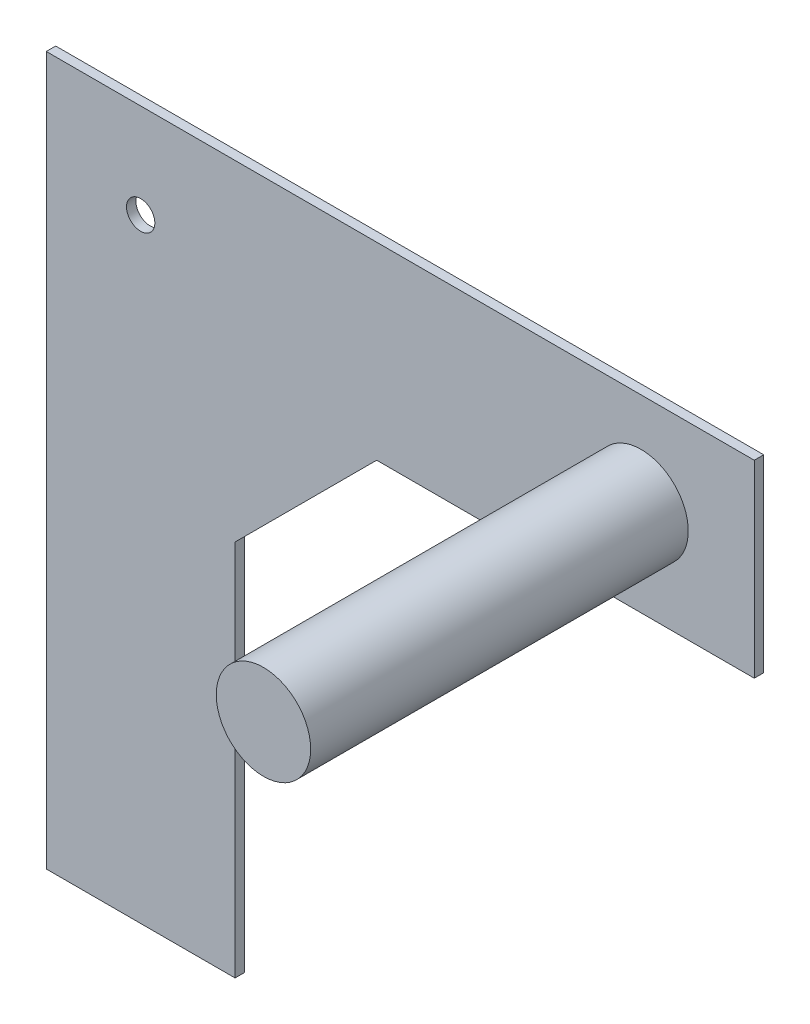
ISO-10303-21;
HEADER;
FILE_DESCRIPTION(('STEP AP214'),'2;1');
FILE_NAME('part.step','',(''),(''),'','','');
FILE_SCHEMA(('AUTOMOTIVE_DESIGN { 1 0 10303 214 1 1 1 1 }'));
ENDSEC;
DATA;
#1=APPLICATION_CONTEXT('core data for automotive mechanical design processes');
#2=APPLICATION_PROTOCOL_DEFINITION('international standard','automotive_design',2000,#1);
#3=PRODUCT_CONTEXT('',#1,'mechanical');
#4=PRODUCT('Part','Part','',(#3));
#5=PRODUCT_RELATED_PRODUCT_CATEGORY('part','',(#4));
#6=PRODUCT_DEFINITION_FORMATION('','',#4);
#7=PRODUCT_DEFINITION_CONTEXT('part definition',#1,'design');
#8=PRODUCT_DEFINITION('design','',#6,#7);
#9=PRODUCT_DEFINITION_SHAPE('','',#8);
#10=(LENGTH_UNIT() NAMED_UNIT(*) SI_UNIT(.MILLI.,.METRE.));
#11=(NAMED_UNIT(*) PLANE_ANGLE_UNIT() SI_UNIT($,.RADIAN.));
#12=(NAMED_UNIT(*) SI_UNIT($,.STERADIAN.) SOLID_ANGLE_UNIT());
#13=UNCERTAINTY_MEASURE_WITH_UNIT(LENGTH_MEASURE(1.E-05),#10,'distance_accuracy_value','');
#14=(GEOMETRIC_REPRESENTATION_CONTEXT(3) GLOBAL_UNCERTAINTY_ASSIGNED_CONTEXT((#13)) GLOBAL_UNIT_ASSIGNED_CONTEXT((#10,
#11,#12)) REPRESENTATION_CONTEXT('',''));
#15=CARTESIAN_POINT('',(0.,0.,0.));
#16=DIRECTION('',(0.,0.,1.));
#17=DIRECTION('',(1.,0.,0.));
#18=AXIS2_PLACEMENT_3D('',#15,#16,#17);
#19=CARTESIAN_POINT('',(-20.,35.,1.));
#20=DIRECTION('',(0.,-1.,0.));
#21=DIRECTION('',(1.,0.,0.));
#22=AXIS2_PLACEMENT_3D('',#19,#20,#21);
#23=PLANE('',#22);
#24=DIRECTION('',(-1.,0.,0.));
#25=VECTOR('',#24,1.);
#26=CARTESIAN_POINT('',(-20.,35.,0.));
#27=LINE('',#26,#25);
#28=CARTESIAN_POINT('',(55.,35.,0.));
#29=VERTEX_POINT('',#28);
#30=CARTESIAN_POINT('',(-20.,35.,0.));
#31=VERTEX_POINT('',#30);
#32=EDGE_CURVE('E124',#29,#31,#27,.T.);
#33=ORIENTED_EDGE('',*,*,#32,.T.);
#34=DIRECTION('',(0.,0.,-1.));
#35=VECTOR('',#34,1.);
#36=CARTESIAN_POINT('',(-20.,35.,1.));
#37=LINE('',#36,#35);
#38=CARTESIAN_POINT('',(-20.,35.,1.));
#39=VERTEX_POINT('',#38);
#40=EDGE_CURVE('E41',#39,#31,#37,.T.);
#41=ORIENTED_EDGE('',*,*,#40,.F.);
#42=DIRECTION('',(-1.,0.,0.));
#43=VECTOR('',#42,1.);
#44=CARTESIAN_POINT('',(-20.,35.,1.));
#45=LINE('',#44,#43);
#46=CARTESIAN_POINT('',(55.,35.,1.));
#47=VERTEX_POINT('',#46);
#48=EDGE_CURVE('E137',#47,#39,#45,.T.);
#49=ORIENTED_EDGE('',*,*,#48,.F.);
#50=DIRECTION('',(0.,0.,-1.));
#51=VECTOR('',#50,1.);
#52=CARTESIAN_POINT('',(55.,35.,1.));
#53=LINE('',#52,#51);
#54=EDGE_CURVE('E120',#47,#29,#53,.T.);
#55=ORIENTED_EDGE('',*,*,#54,.T.);
#56=EDGE_LOOP('',(#33,#41,#49,#55));
#57=FACE_BOUND('',#56,.T.);
#58=ADVANCED_FACE('F33',(#57),#23,.F.);
#59=CARTESIAN_POINT('',(-20.,35.,1.));
#60=DIRECTION('',(1.,0.,0.));
#61=DIRECTION('',(0.,1.,0.));
#62=AXIS2_PLACEMENT_3D('',#59,#60,#61);
#63=PLANE('',#62);
#64=DIRECTION('',(0.,-1.,0.));
#65=VECTOR('',#64,1.);
#66=CARTESIAN_POINT('',(-20.,35.,0.));
#67=LINE('',#66,#65);
#68=CARTESIAN_POINT('',(-20.,-40.,0.));
#69=VERTEX_POINT('',#68);
#70=EDGE_CURVE('E127',#31,#69,#67,.T.);
#71=ORIENTED_EDGE('',*,*,#70,.T.);
#72=DIRECTION('',(0.,0.,-1.));
#73=VECTOR('',#72,1.);
#74=CARTESIAN_POINT('',(-20.,-40.,1.));
#75=LINE('',#74,#73);
#76=CARTESIAN_POINT('',(-20.,-40.,1.));
#77=VERTEX_POINT('',#76);
#78=EDGE_CURVE('E144',#77,#69,#75,.T.);
#79=ORIENTED_EDGE('',*,*,#78,.F.);
#80=DIRECTION('',(0.,-1.,0.));
#81=VECTOR('',#80,1.);
#82=CARTESIAN_POINT('',(-20.,35.,1.));
#83=LINE('',#82,#81);
#84=EDGE_CURVE('E90',#39,#77,#83,.T.);
#85=ORIENTED_EDGE('',*,*,#84,.F.);
#86=ORIENTED_EDGE('',*,*,#40,.T.);
#87=EDGE_LOOP('',(#71,#79,#85,#86));
#88=FACE_BOUND('',#87,.T.);
#89=ADVANCED_FACE('F147',(#88),#63,.F.);
#90=CARTESIAN_POINT('',(-20.,-40.,1.));
#91=DIRECTION('',(0.,1.,0.));
#92=DIRECTION('',(0.,0.,1.));
#93=AXIS2_PLACEMENT_3D('',#90,#91,#92);
#94=PLANE('',#93);
#95=DIRECTION('',(1.,0.,0.));
#96=VECTOR('',#95,1.);
#97=CARTESIAN_POINT('',(-20.,-40.,0.));
#98=LINE('',#97,#96);
#99=CARTESIAN_POINT('',(0.,-40.,0.));
#100=VERTEX_POINT('',#99);
#101=EDGE_CURVE('E130',#69,#100,#98,.T.);
#102=ORIENTED_EDGE('',*,*,#101,.T.);
#103=DIRECTION('',(0.,0.,-1.));
#104=VECTOR('',#103,1.);
#105=CARTESIAN_POINT('',(0.,-40.,1.));
#106=LINE('',#105,#104);
#107=CARTESIAN_POINT('',(0.,-40.,1.));
#108=VERTEX_POINT('',#107);
#109=EDGE_CURVE('E141',#108,#100,#106,.T.);
#110=ORIENTED_EDGE('',*,*,#109,.F.);
#111=DIRECTION('',(1.,0.,0.));
#112=VECTOR('',#111,1.);
#113=CARTESIAN_POINT('',(-20.,-40.,1.));
#114=LINE('',#113,#112);
#115=EDGE_CURVE('E161',#77,#108,#114,.T.);
#116=ORIENTED_EDGE('',*,*,#115,.F.);
#117=ORIENTED_EDGE('',*,*,#78,.T.);
#118=EDGE_LOOP('',(#102,#110,#116,#117));
#119=FACE_BOUND('',#118,.T.);
#120=ADVANCED_FACE('F157',(#119),#94,.F.);
#121=CARTESIAN_POINT('',(0.,-40.,1.));
#122=DIRECTION('',(-1.,0.,0.));
#123=DIRECTION('',(0.,0.,1.));
#124=AXIS2_PLACEMENT_3D('',#121,#122,#123);
#125=PLANE('',#124);
#126=DIRECTION('',(0.,1.,0.));
#127=VECTOR('',#126,1.);
#128=CARTESIAN_POINT('',(0.,-40.,0.));
#129=LINE('',#128,#127);
#130=CARTESIAN_POINT('',(0.,0.,0.));
#131=VERTEX_POINT('',#130);
#132=EDGE_CURVE('E132',#100,#131,#129,.T.);
#133=ORIENTED_EDGE('',*,*,#132,.T.);
#134=DIRECTION('',(0.,0.,-1.));
#135=VECTOR('',#134,1.);
#136=CARTESIAN_POINT('',(0.,0.,1.));
#137=LINE('',#136,#135);
#138=CARTESIAN_POINT('',(0.,0.,1.));
#139=VERTEX_POINT('',#138);
#140=EDGE_CURVE('E115',#139,#131,#137,.T.);
#141=ORIENTED_EDGE('',*,*,#140,.F.);
#142=DIRECTION('',(0.,1.,0.));
#143=VECTOR('',#142,1.);
#144=CARTESIAN_POINT('',(0.,-40.,1.));
#145=LINE('',#144,#143);
#146=EDGE_CURVE('E106',#108,#139,#145,.T.);
#147=ORIENTED_EDGE('',*,*,#146,.F.);
#148=ORIENTED_EDGE('',*,*,#109,.T.);
#149=EDGE_LOOP('',(#133,#141,#147,#148));
#150=FACE_BOUND('',#149,.T.);
#151=ADVANCED_FACE('F160',(#150),#125,.F.);
#152=CARTESIAN_POINT('',(15.,15.,1.));
#153=DIRECTION('',(-0.707106781186548,0.707106781186547,0.));
#154=DIRECTION('',(-0.707106781186547,-0.707106781186548,0.));
#155=AXIS2_PLACEMENT_3D('',#152,#153,#154);
#156=PLANE('',#155);
#157=DIRECTION('',(0.707106781186547,0.707106781186548,0.));
#158=VECTOR('',#157,1.);
#159=CARTESIAN_POINT('',(15.,15.,0.));
#160=LINE('',#159,#158);
#161=CARTESIAN_POINT('',(15.,15.,0.));
#162=VERTEX_POINT('',#161);
#163=EDGE_CURVE('E114',#131,#162,#160,.T.);
#164=ORIENTED_EDGE('',*,*,#163,.T.);
#165=DIRECTION('',(0.,0.,-1.));
#166=VECTOR('',#165,1.);
#167=CARTESIAN_POINT('',(15.,15.,1.));
#168=LINE('',#167,#166);
#169=CARTESIAN_POINT('',(15.,15.,1.));
#170=VERTEX_POINT('',#169);
#171=EDGE_CURVE('E111',#170,#162,#168,.T.);
#172=ORIENTED_EDGE('',*,*,#171,.F.);
#173=DIRECTION('',(0.707106781186547,0.707106781186548,0.));
#174=VECTOR('',#173,1.);
#175=CARTESIAN_POINT('',(15.,15.,1.));
#176=LINE('',#175,#174);
#177=EDGE_CURVE('E100',#139,#170,#176,.T.);
#178=ORIENTED_EDGE('',*,*,#177,.F.);
#179=ORIENTED_EDGE('',*,*,#140,.T.);
#180=EDGE_LOOP('',(#164,#172,#178,#179));
#181=FACE_BOUND('',#180,.T.);
#182=ADVANCED_FACE('F112',(#181),#156,.F.);
#183=CARTESIAN_POINT('',(55.,15.,1.));
#184=DIRECTION('',(0.,1.,0.));
#185=DIRECTION('',(-1.,0.,0.));
#186=AXIS2_PLACEMENT_3D('',#183,#184,#185);
#187=PLANE('',#186);
#188=DIRECTION('',(1.,0.,0.));
#189=VECTOR('',#188,1.);
#190=CARTESIAN_POINT('',(55.,15.,0.));
#191=LINE('',#190,#189);
#192=CARTESIAN_POINT('',(55.,15.,0.));
#193=VERTEX_POINT('',#192);
#194=EDGE_CURVE('E75',#162,#193,#191,.T.);
#195=ORIENTED_EDGE('',*,*,#194,.T.);
#196=DIRECTION('',(0.,0.,-1.));
#197=VECTOR('',#196,1.);
#198=CARTESIAN_POINT('',(55.,15.,1.));
#199=LINE('',#198,#197);
#200=CARTESIAN_POINT('',(55.,15.,1.));
#201=VERTEX_POINT('',#200);
#202=EDGE_CURVE('E116',#201,#193,#199,.T.);
#203=ORIENTED_EDGE('',*,*,#202,.F.);
#204=DIRECTION('',(1.,0.,0.));
#205=VECTOR('',#204,1.);
#206=CARTESIAN_POINT('',(55.,15.,1.));
#207=LINE('',#206,#205);
#208=EDGE_CURVE('E104',#170,#201,#207,.T.);
#209=ORIENTED_EDGE('',*,*,#208,.F.);
#210=ORIENTED_EDGE('',*,*,#171,.T.);
#211=EDGE_LOOP('',(#195,#203,#209,#210));
#212=FACE_BOUND('',#211,.T.);
#213=ADVANCED_FACE('F118',(#212),#187,.F.);
#214=CARTESIAN_POINT('',(55.,35.,1.));
#215=DIRECTION('',(-1.,0.,0.));
#216=DIRECTION('',(0.,-1.,0.));
#217=AXIS2_PLACEMENT_3D('',#214,#215,#216);
#218=PLANE('',#217);
#219=DIRECTION('',(0.,1.,0.));
#220=VECTOR('',#219,1.);
#221=CARTESIAN_POINT('',(55.,35.,0.));
#222=LINE('',#221,#220);
#223=EDGE_CURVE('E81',#193,#29,#222,.T.);
#224=ORIENTED_EDGE('',*,*,#223,.T.);
#225=ORIENTED_EDGE('',*,*,#54,.F.);
#226=DIRECTION('',(0.,1.,0.));
#227=VECTOR('',#226,1.);
#228=CARTESIAN_POINT('',(55.,35.,1.));
#229=LINE('',#228,#227);
#230=EDGE_CURVE('E49',#201,#47,#229,.T.);
#231=ORIENTED_EDGE('',*,*,#230,.F.);
#232=ORIENTED_EDGE('',*,*,#202,.T.);
#233=EDGE_LOOP('',(#224,#225,#231,#232));
#234=FACE_BOUND('',#233,.T.);
#235=ADVANCED_FACE('F186',(#234),#218,.F.);
#236=CARTESIAN_POINT('',(0.,0.,1.));
#237=DIRECTION('',(0.,0.,-1.));
#238=DIRECTION('',(-1.,0.,0.));
#239=AXIS2_PLACEMENT_3D('',#236,#237,#238);
#240=PLANE('',#239);
#241=CARTESIAN_POINT('',(43.0070081469509,25.,1.));
#242=DIRECTION('',(0.,0.,-1.));
#243=DIRECTION('',(-1.,0.,0.));
#244=AXIS2_PLACEMENT_3D('',#241,#242,#243);
#245=CIRCLE('',#244,5.);
#246=CARTESIAN_POINT('',(38.0070081469509,25.,1.));
#247=VERTEX_POINT('',#246);
#248=EDGE_CURVE('E11',#247,#247,#245,.F.);
#249=ORIENTED_EDGE('',*,*,#248,.F.);
#250=EDGE_LOOP('',(#249));
#251=FACE_BOUND('',#250,.T.);
#252=CARTESIAN_POINT('',(-10.,25.0001495626222,1.));
#253=DIRECTION('',(0.,0.,1.));
#254=DIRECTION('',(1.,0.,0.));
#255=AXIS2_PLACEMENT_3D('',#252,#253,#254);
#256=CIRCLE('',#255,1.5);
#257=CARTESIAN_POINT('',(-8.5,25.0001495626222,1.));
#258=VERTEX_POINT('',#257);
#259=EDGE_CURVE('E166',#258,#258,#256,.T.);
#260=ORIENTED_EDGE('',*,*,#259,.F.);
#261=EDGE_LOOP('',(#260));
#262=FACE_BOUND('',#261,.T.);
#263=ORIENTED_EDGE('',*,*,#48,.T.);
#264=ORIENTED_EDGE('',*,*,#84,.T.);
#265=ORIENTED_EDGE('',*,*,#115,.T.);
#266=ORIENTED_EDGE('',*,*,#146,.T.);
#267=ORIENTED_EDGE('',*,*,#177,.T.);
#268=ORIENTED_EDGE('',*,*,#208,.T.);
#269=ORIENTED_EDGE('',*,*,#230,.T.);
#270=EDGE_LOOP('',(#263,#264,#265,#266,#267,#268,#269));
#271=FACE_BOUND('',#270,.T.);
#272=ADVANCED_FACE('F102',(#251,#262,#271),#240,.F.);
#273=CARTESIAN_POINT('',(0.,0.,0.));
#274=DIRECTION('',(0.,0.,-1.));
#275=DIRECTION('',(-1.,0.,0.));
#276=AXIS2_PLACEMENT_3D('',#273,#274,#275);
#277=PLANE('',#276);
#278=CARTESIAN_POINT('',(-10.,25.0001495626222,0.));
#279=DIRECTION('',(0.,0.,1.));
#280=DIRECTION('',(1.,0.,0.));
#281=AXIS2_PLACEMENT_3D('',#278,#279,#280);
#282=CIRCLE('',#281,1.5);
#283=CARTESIAN_POINT('',(-8.5,25.0001495626222,0.));
#284=VERTEX_POINT('',#283);
#285=EDGE_CURVE('E128',#284,#284,#282,.T.);
#286=ORIENTED_EDGE('',*,*,#285,.T.);
#287=EDGE_LOOP('',(#286));
#288=FACE_BOUND('',#287,.T.);
#289=ORIENTED_EDGE('',*,*,#32,.F.);
#290=ORIENTED_EDGE('',*,*,#223,.F.);
#291=ORIENTED_EDGE('',*,*,#194,.F.);
#292=ORIENTED_EDGE('',*,*,#163,.F.);
#293=ORIENTED_EDGE('',*,*,#132,.F.);
#294=ORIENTED_EDGE('',*,*,#101,.F.);
#295=ORIENTED_EDGE('',*,*,#70,.F.);
#296=EDGE_LOOP('',(#289,#290,#291,#292,#293,#294,#295));
#297=FACE_BOUND('',#296,.T.);
#298=ADVANCED_FACE('F152',(#288,#297),#277,.T.);
#299=CARTESIAN_POINT('',(-10.,25.0001495626222,0.));
#300=DIRECTION('',(0.,0.,1.));
#301=DIRECTION('',(1.,0.,0.));
#302=AXIS2_PLACEMENT_3D('',#299,#300,#301);
#303=CYLINDRICAL_SURFACE('',#302,1.5);
#304=ORIENTED_EDGE('',*,*,#285,.F.);
#305=EDGE_LOOP('',(#304));
#306=FACE_BOUND('',#305,.T.);
#307=ORIENTED_EDGE('',*,*,#259,.T.);
#308=EDGE_LOOP('',(#307));
#309=FACE_BOUND('',#308,.T.);
#310=ADVANCED_FACE('F180',(#306,#309),#303,.F.);
#311=CARTESIAN_POINT('',(43.0070081469509,25.,41.));
#312=DIRECTION('',(0.,0.,-1.));
#313=DIRECTION('',(-1.,0.,0.));
#314=AXIS2_PLACEMENT_3D('',#311,#312,#313);
#315=CYLINDRICAL_SURFACE('',#314,5.);
#316=CARTESIAN_POINT('',(43.0070081469509,25.,41.));
#317=DIRECTION('',(0.,0.,1.));
#318=DIRECTION('',(1.,0.,0.));
#319=AXIS2_PLACEMENT_3D('',#316,#317,#318);
#320=CIRCLE('',#319,5.);
#321=CARTESIAN_POINT('',(48.0070081469509,25.,41.));
#322=VERTEX_POINT('',#321);
#323=EDGE_CURVE('E169',#322,#322,#320,.T.);
#324=ORIENTED_EDGE('',*,*,#323,.F.);
#325=EDGE_LOOP('',(#324));
#326=FACE_BOUND('',#325,.T.);
#327=ORIENTED_EDGE('',*,*,#248,.T.);
#328=EDGE_LOOP('',(#327));
#329=FACE_BOUND('',#328,.T.);
#330=ADVANCED_FACE('F177',(#326,#329),#315,.T.);
#331=CARTESIAN_POINT('',(43.0070081469509,25.,41.));
#332=DIRECTION('',(0.,0.,1.));
#333=DIRECTION('',(1.,0.,0.));
#334=AXIS2_PLACEMENT_3D('',#331,#332,#333);
#335=PLANE('',#334);
#336=ORIENTED_EDGE('',*,*,#323,.T.);
#337=EDGE_LOOP('',(#336));
#338=FACE_BOUND('',#337,.T.);
#339=ADVANCED_FACE('F175',(#338),#335,.T.);
#340=CLOSED_SHELL('',(#58,#89,#120,#151,#182,#213,#235,#272,#298,#310,#330,#339));
#341=MANIFOLD_SOLID_BREP('B2',#340);
#342=ADVANCED_BREP_SHAPE_REPRESENTATION('',(#18,#341),#14);
#343=SHAPE_DEFINITION_REPRESENTATION(#9,#342);
ENDSEC;
END-ISO-10303-21;
